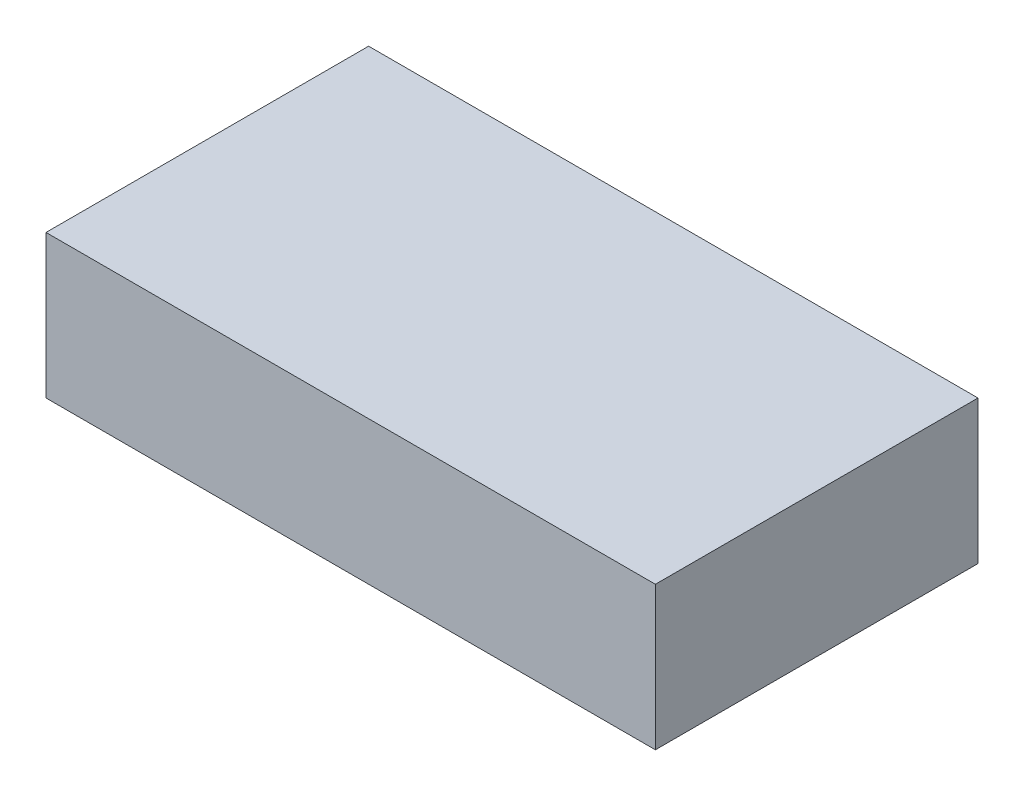
ISO-10303-21;
HEADER;
FILE_DESCRIPTION(('STEP AP214'),'2;1');
FILE_NAME('part.step','',(''),(''),'','','');
FILE_SCHEMA(('AUTOMOTIVE_DESIGN { 1 0 10303 214 1 1 1 1 }'));
ENDSEC;
DATA;
#1=APPLICATION_CONTEXT('core data for automotive mechanical design processes');
#2=APPLICATION_PROTOCOL_DEFINITION('international standard','automotive_design',2000,#1);
#3=PRODUCT_CONTEXT('',#1,'mechanical');
#4=PRODUCT('Part','Part','',(#3));
#5=PRODUCT_RELATED_PRODUCT_CATEGORY('part','',(#4));
#6=PRODUCT_DEFINITION_FORMATION('','',#4);
#7=PRODUCT_DEFINITION_CONTEXT('part definition',#1,'design');
#8=PRODUCT_DEFINITION('design','',#6,#7);
#9=PRODUCT_DEFINITION_SHAPE('','',#8);
#10=(LENGTH_UNIT() NAMED_UNIT(*) SI_UNIT(.MILLI.,.METRE.));
#11=(NAMED_UNIT(*) PLANE_ANGLE_UNIT() SI_UNIT($,.RADIAN.));
#12=(NAMED_UNIT(*) SI_UNIT($,.STERADIAN.) SOLID_ANGLE_UNIT());
#13=UNCERTAINTY_MEASURE_WITH_UNIT(LENGTH_MEASURE(1.E-05),#10,'distance_accuracy_value','');
#14=(GEOMETRIC_REPRESENTATION_CONTEXT(3) GLOBAL_UNCERTAINTY_ASSIGNED_CONTEXT((#13)) GLOBAL_UNIT_ASSIGNED_CONTEXT((#10,
#11,#12)) REPRESENTATION_CONTEXT('',''));
#15=CARTESIAN_POINT('',(0.,0.,0.));
#16=DIRECTION('',(0.,0.,1.));
#17=DIRECTION('',(1.,0.,0.));
#18=AXIS2_PLACEMENT_3D('',#15,#16,#17);
#19=CARTESIAN_POINT('',(107.95,50.8,-57.15));
#20=DIRECTION('',(-1.,0.,0.));
#21=DIRECTION('',(0.,0.,1.));
#22=AXIS2_PLACEMENT_3D('',#19,#20,#21);
#23=PLANE('',#22);
#24=DIRECTION('',(0.,0.,-1.));
#25=VECTOR('',#24,1.);
#26=CARTESIAN_POINT('',(107.95,0.,-57.15));
#27=LINE('',#26,#25);
#28=CARTESIAN_POINT('',(107.95,0.,57.15));
#29=VERTEX_POINT('',#28);
#30=CARTESIAN_POINT('',(107.95,0.,-57.15));
#31=VERTEX_POINT('',#30);
#32=EDGE_CURVE('E100',#29,#31,#27,.T.);
#33=ORIENTED_EDGE('',*,*,#32,.T.);
#34=DIRECTION('',(0.,-1.,0.));
#35=VECTOR('',#34,1.);
#36=CARTESIAN_POINT('',(107.95,50.8,-57.15));
#37=LINE('',#36,#35);
#38=CARTESIAN_POINT('',(107.95,50.8,-57.15));
#39=VERTEX_POINT('',#38);
#40=EDGE_CURVE('E11',#39,#31,#37,.T.);
#41=ORIENTED_EDGE('',*,*,#40,.F.);
#42=DIRECTION('',(0.,0.,-1.));
#43=VECTOR('',#42,1.);
#44=CARTESIAN_POINT('',(107.95,50.8,-57.15));
#45=LINE('',#44,#43);
#46=CARTESIAN_POINT('',(107.95,50.8,57.15));
#47=VERTEX_POINT('',#46);
#48=EDGE_CURVE('E88',#47,#39,#45,.T.);
#49=ORIENTED_EDGE('',*,*,#48,.F.);
#50=DIRECTION('',(0.,-1.,0.));
#51=VECTOR('',#50,1.);
#52=CARTESIAN_POINT('',(107.95,50.8,57.15));
#53=LINE('',#52,#51);
#54=EDGE_CURVE('E96',#47,#29,#53,.T.);
#55=ORIENTED_EDGE('',*,*,#54,.T.);
#56=EDGE_LOOP('',(#33,#41,#49,#55));
#57=FACE_BOUND('',#56,.T.);
#58=ADVANCED_FACE('F37',(#57),#23,.F.);
#59=CARTESIAN_POINT('',(-107.95,50.8,-57.15));
#60=DIRECTION('',(0.,0.,1.));
#61=DIRECTION('',(1.,0.,0.));
#62=AXIS2_PLACEMENT_3D('',#59,#60,#61);
#63=PLANE('',#62);
#64=DIRECTION('',(-1.,0.,0.));
#65=VECTOR('',#64,1.);
#66=CARTESIAN_POINT('',(-107.95,0.,-57.15));
#67=LINE('',#66,#65);
#68=CARTESIAN_POINT('',(-107.95,0.,-57.15));
#69=VERTEX_POINT('',#68);
#70=EDGE_CURVE('E92',#31,#69,#67,.T.);
#71=ORIENTED_EDGE('',*,*,#70,.T.);
#72=DIRECTION('',(0.,-1.,0.));
#73=VECTOR('',#72,1.);
#74=CARTESIAN_POINT('',(-107.95,50.8,-57.15));
#75=LINE('',#74,#73);
#76=CARTESIAN_POINT('',(-107.95,50.8,-57.15));
#77=VERTEX_POINT('',#76);
#78=EDGE_CURVE('E45',#77,#69,#75,.T.);
#79=ORIENTED_EDGE('',*,*,#78,.F.);
#80=DIRECTION('',(-1.,0.,0.));
#81=VECTOR('',#80,1.);
#82=CARTESIAN_POINT('',(-107.95,50.8,-57.15));
#83=LINE('',#82,#81);
#84=EDGE_CURVE('E83',#39,#77,#83,.T.);
#85=ORIENTED_EDGE('',*,*,#84,.F.);
#86=ORIENTED_EDGE('',*,*,#40,.T.);
#87=EDGE_LOOP('',(#71,#79,#85,#86));
#88=FACE_BOUND('',#87,.T.);
#89=ADVANCED_FACE('F91',(#88),#63,.F.);
#90=CARTESIAN_POINT('',(-107.95,50.8,-57.15));
#91=DIRECTION('',(1.,0.,0.));
#92=DIRECTION('',(0.,0.,-1.));
#93=AXIS2_PLACEMENT_3D('',#90,#91,#92);
#94=PLANE('',#93);
#95=DIRECTION('',(0.,0.,1.));
#96=VECTOR('',#95,1.);
#97=CARTESIAN_POINT('',(-107.95,0.,-57.15));
#98=LINE('',#97,#96);
#99=CARTESIAN_POINT('',(-107.95,0.,57.15));
#100=VERTEX_POINT('',#99);
#101=EDGE_CURVE('E70',#69,#100,#98,.T.);
#102=ORIENTED_EDGE('',*,*,#101,.T.);
#103=DIRECTION('',(0.,-1.,0.));
#104=VECTOR('',#103,1.);
#105=CARTESIAN_POINT('',(-107.95,50.8,57.15));
#106=LINE('',#105,#104);
#107=CARTESIAN_POINT('',(-107.95,50.8,57.15));
#108=VERTEX_POINT('',#107);
#109=EDGE_CURVE('E93',#108,#100,#106,.T.);
#110=ORIENTED_EDGE('',*,*,#109,.F.);
#111=DIRECTION('',(0.,0.,1.));
#112=VECTOR('',#111,1.);
#113=CARTESIAN_POINT('',(-107.95,50.8,-57.15));
#114=LINE('',#113,#112);
#115=EDGE_CURVE('E86',#77,#108,#114,.T.);
#116=ORIENTED_EDGE('',*,*,#115,.F.);
#117=ORIENTED_EDGE('',*,*,#78,.T.);
#118=EDGE_LOOP('',(#102,#110,#116,#117));
#119=FACE_BOUND('',#118,.T.);
#120=ADVANCED_FACE('F94',(#119),#94,.F.);
#121=CARTESIAN_POINT('',(-107.95,50.8,57.15));
#122=DIRECTION('',(0.,0.,-1.));
#123=DIRECTION('',(-1.,0.,0.));
#124=AXIS2_PLACEMENT_3D('',#121,#122,#123);
#125=PLANE('',#124);
#126=DIRECTION('',(1.,0.,0.));
#127=VECTOR('',#126,1.);
#128=CARTESIAN_POINT('',(-107.95,0.,57.15));
#129=LINE('',#128,#127);
#130=EDGE_CURVE('E76',#100,#29,#129,.T.);
#131=ORIENTED_EDGE('',*,*,#130,.T.);
#132=ORIENTED_EDGE('',*,*,#54,.F.);
#133=DIRECTION('',(1.,0.,0.));
#134=VECTOR('',#133,1.);
#135=CARTESIAN_POINT('',(-107.95,50.8,57.15));
#136=LINE('',#135,#134);
#137=EDGE_CURVE('E53',#108,#47,#136,.T.);
#138=ORIENTED_EDGE('',*,*,#137,.F.);
#139=ORIENTED_EDGE('',*,*,#109,.T.);
#140=EDGE_LOOP('',(#131,#132,#138,#139));
#141=FACE_BOUND('',#140,.T.);
#142=ADVANCED_FACE('F107',(#141),#125,.F.);
#143=CARTESIAN_POINT('',(0.,50.8,0.));
#144=DIRECTION('',(0.,1.,0.));
#145=DIRECTION('',(0.,0.,1.));
#146=AXIS2_PLACEMENT_3D('',#143,#144,#145);
#147=PLANE('',#146);
#148=ORIENTED_EDGE('',*,*,#48,.T.);
#149=ORIENTED_EDGE('',*,*,#84,.T.);
#150=ORIENTED_EDGE('',*,*,#115,.T.);
#151=ORIENTED_EDGE('',*,*,#137,.T.);
#152=EDGE_LOOP('',(#148,#149,#150,#151));
#153=FACE_BOUND('',#152,.T.);
#154=ADVANCED_FACE('F84',(#153),#147,.T.);
#155=CARTESIAN_POINT('',(0.,0.,0.));
#156=DIRECTION('',(0.,1.,0.));
#157=DIRECTION('',(0.,0.,1.));
#158=AXIS2_PLACEMENT_3D('',#155,#156,#157);
#159=PLANE('',#158);
#160=ORIENTED_EDGE('',*,*,#32,.F.);
#161=ORIENTED_EDGE('',*,*,#130,.F.);
#162=ORIENTED_EDGE('',*,*,#101,.F.);
#163=ORIENTED_EDGE('',*,*,#70,.F.);
#164=EDGE_LOOP('',(#160,#161,#162,#163));
#165=FACE_BOUND('',#164,.T.);
#166=ADVANCED_FACE('F110',(#165),#159,.F.);
#167=CLOSED_SHELL('',(#58,#89,#120,#142,#154,#166));
#168=MANIFOLD_SOLID_BREP('B2',#167);
#169=ADVANCED_BREP_SHAPE_REPRESENTATION('',(#18,#168),#14);
#170=SHAPE_DEFINITION_REPRESENTATION(#9,#169);
ENDSEC;
END-ISO-10303-21;
